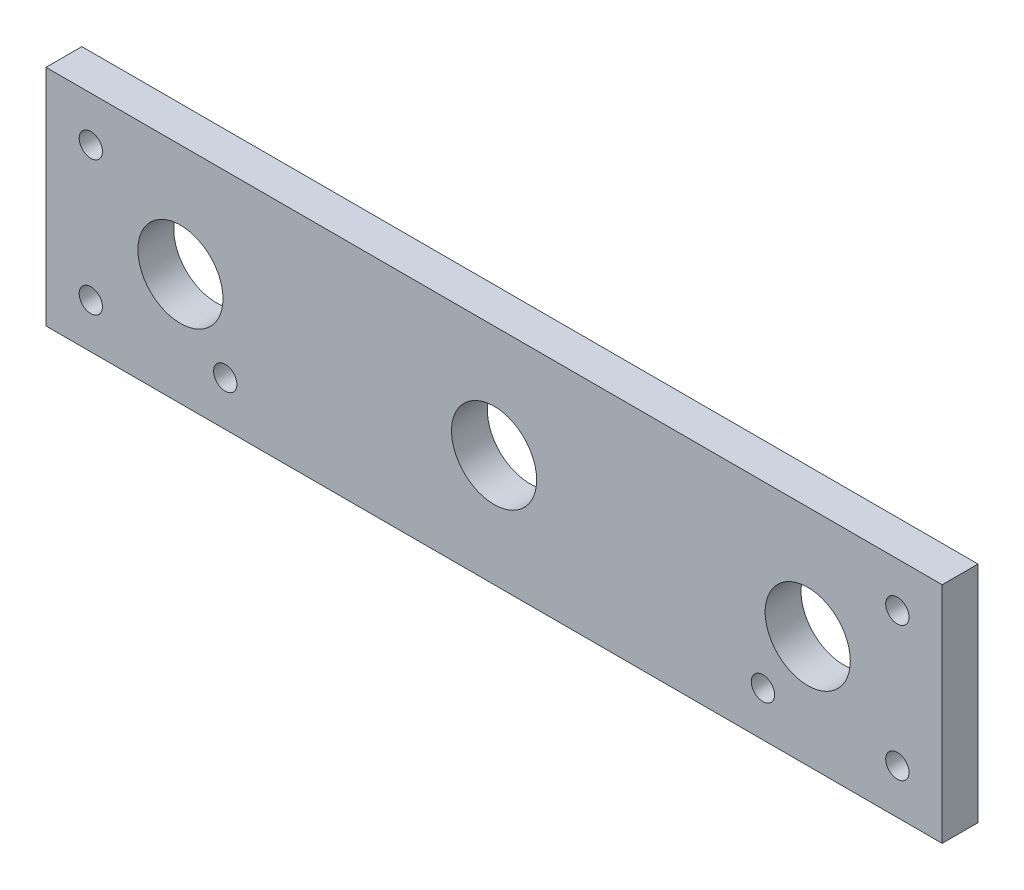
ISO-10303-21;
HEADER;
FILE_DESCRIPTION(('STEP AP214'),'2;1');
FILE_NAME('part.step','',(''),(''),'','','');
FILE_SCHEMA(('AUTOMOTIVE_DESIGN { 1 0 10303 214 1 1 1 1 }'));
ENDSEC;
DATA;
#1=APPLICATION_CONTEXT('core data for automotive mechanical design processes');
#2=APPLICATION_PROTOCOL_DEFINITION('international standard','automotive_design',2000,#1);
#3=PRODUCT_CONTEXT('',#1,'mechanical');
#4=PRODUCT('Part','Part','',(#3));
#5=PRODUCT_RELATED_PRODUCT_CATEGORY('part','',(#4));
#6=PRODUCT_DEFINITION_FORMATION('','',#4);
#7=PRODUCT_DEFINITION_CONTEXT('part definition',#1,'design');
#8=PRODUCT_DEFINITION('design','',#6,#7);
#9=PRODUCT_DEFINITION_SHAPE('','',#8);
#10=(LENGTH_UNIT() NAMED_UNIT(*) SI_UNIT(.MILLI.,.METRE.));
#11=(NAMED_UNIT(*) PLANE_ANGLE_UNIT() SI_UNIT($,.RADIAN.));
#12=(NAMED_UNIT(*) SI_UNIT($,.STERADIAN.) SOLID_ANGLE_UNIT());
#13=UNCERTAINTY_MEASURE_WITH_UNIT(LENGTH_MEASURE(1.E-05),#10,'distance_accuracy_value','');
#14=(GEOMETRIC_REPRESENTATION_CONTEXT(3) GLOBAL_UNCERTAINTY_ASSIGNED_CONTEXT((#13)) GLOBAL_UNIT_ASSIGNED_CONTEXT((#10,
#11,#12)) REPRESENTATION_CONTEXT('',''));
#15=CARTESIAN_POINT('',(0.,0.,0.));
#16=DIRECTION('',(0.,0.,1.));
#17=DIRECTION('',(1.,0.,0.));
#18=AXIS2_PLACEMENT_3D('',#15,#16,#17);
#19=CARTESIAN_POINT('',(0.,-1.68869309838472,8.));
#20=DIRECTION('',(0.,1.,0.));
#21=DIRECTION('',(0.,0.,1.));
#22=AXIS2_PLACEMENT_3D('',#19,#20,#21);
#23=PLANE('',#22);
#24=DIRECTION('',(1.,0.,0.));
#25=VECTOR('',#24,1.);
#26=CARTESIAN_POINT('',(0.,-1.68869309838472,0.));
#27=LINE('',#26,#25);
#28=CARTESIAN_POINT('',(-58.1497797356829,-1.68869309838472,0.));
#29=VERTEX_POINT('',#28);
#30=CARTESIAN_POINT('',(141.850220264317,-1.68869309838472,0.));
#31=VERTEX_POINT('',#30);
#32=EDGE_CURVE('E129',#29,#31,#27,.T.);
#33=ORIENTED_EDGE('',*,*,#32,.F.);
#34=DIRECTION('',(0.,0.,-1.));
#35=VECTOR('',#34,1.);
#36=CARTESIAN_POINT('',(-58.1497797356829,-1.68869309838472,8.));
#37=LINE('',#36,#35);
#38=CARTESIAN_POINT('',(-58.1497797356829,-1.68869309838472,8.));
#39=VERTEX_POINT('',#38);
#40=EDGE_CURVE('E11',#39,#29,#37,.T.);
#41=ORIENTED_EDGE('',*,*,#40,.F.);
#42=DIRECTION('',(1.,0.,0.));
#43=VECTOR('',#42,1.);
#44=CARTESIAN_POINT('',(0.,-1.68869309838472,8.));
#45=LINE('',#44,#43);
#46=CARTESIAN_POINT('',(141.850220264317,-1.68869309838472,8.));
#47=VERTEX_POINT('',#46);
#48=EDGE_CURVE('E100',#39,#47,#45,.T.);
#49=ORIENTED_EDGE('',*,*,#48,.T.);
#50=DIRECTION('',(0.,0.,-1.));
#51=VECTOR('',#50,1.);
#52=CARTESIAN_POINT('',(141.850220264317,-1.68869309838472,8.));
#53=LINE('',#52,#51);
#54=EDGE_CURVE('E60',#47,#31,#53,.T.);
#55=ORIENTED_EDGE('',*,*,#54,.T.);
#56=EDGE_LOOP('',(#33,#41,#49,#55));
#57=FACE_BOUND('',#56,.T.);
#58=ADVANCED_FACE('F41',(#57),#23,.T.);
#59=CARTESIAN_POINT('',(-58.1497797356829,0.,8.));
#60=DIRECTION('',(1.,0.,0.));
#61=DIRECTION('',(0.,1.,0.));
#62=AXIS2_PLACEMENT_3D('',#59,#60,#61);
#63=PLANE('',#62);
#64=DIRECTION('',(0.,-1.,0.));
#65=VECTOR('',#64,1.);
#66=CARTESIAN_POINT('',(-58.1497797356829,0.,0.));
#67=LINE('',#66,#65);
#68=CARTESIAN_POINT('',(-58.1497797356828,-51.6886930983847,0.));
#69=VERTEX_POINT('',#68);
#70=EDGE_CURVE('E106',#29,#69,#67,.T.);
#71=ORIENTED_EDGE('',*,*,#70,.T.);
#72=DIRECTION('',(0.,0.,-1.));
#73=VECTOR('',#72,1.);
#74=CARTESIAN_POINT('',(-58.1497797356828,-51.6886930983847,8.));
#75=LINE('',#74,#73);
#76=CARTESIAN_POINT('',(-58.1497797356828,-51.6886930983847,8.));
#77=VERTEX_POINT('',#76);
#78=EDGE_CURVE('E52',#77,#69,#75,.T.);
#79=ORIENTED_EDGE('',*,*,#78,.F.);
#80=DIRECTION('',(0.,-1.,0.));
#81=VECTOR('',#80,1.);
#82=CARTESIAN_POINT('',(-58.1497797356829,0.,8.));
#83=LINE('',#82,#81);
#84=EDGE_CURVE('E95',#39,#77,#83,.T.);
#85=ORIENTED_EDGE('',*,*,#84,.F.);
#86=ORIENTED_EDGE('',*,*,#40,.T.);
#87=EDGE_LOOP('',(#71,#79,#85,#86));
#88=FACE_BOUND('',#87,.T.);
#89=ADVANCED_FACE('F104',(#88),#63,.F.);
#90=CARTESIAN_POINT('',(0.,-51.6886930983847,8.));
#91=DIRECTION('',(0.,1.,0.));
#92=DIRECTION('',(0.,0.,1.));
#93=AXIS2_PLACEMENT_3D('',#90,#91,#92);
#94=PLANE('',#93);
#95=DIRECTION('',(1.,0.,0.));
#96=VECTOR('',#95,1.);
#97=CARTESIAN_POINT('',(0.,-51.6886930983847,0.));
#98=LINE('',#97,#96);
#99=CARTESIAN_POINT('',(141.850220264317,-51.6886930983847,0.));
#100=VERTEX_POINT('',#99);
#101=EDGE_CURVE('E124',#69,#100,#98,.T.);
#102=ORIENTED_EDGE('',*,*,#101,.T.);
#103=DIRECTION('',(0.,0.,-1.));
#104=VECTOR('',#103,1.);
#105=CARTESIAN_POINT('',(141.850220264317,-51.6886930983847,8.));
#106=LINE('',#105,#104);
#107=CARTESIAN_POINT('',(141.850220264317,-51.6886930983847,8.));
#108=VERTEX_POINT('',#107);
#109=EDGE_CURVE('E74',#108,#100,#106,.T.);
#110=ORIENTED_EDGE('',*,*,#109,.F.);
#111=DIRECTION('',(1.,0.,0.));
#112=VECTOR('',#111,1.);
#113=CARTESIAN_POINT('',(0.,-51.6886930983847,8.));
#114=LINE('',#113,#112);
#115=EDGE_CURVE('E86',#77,#108,#114,.T.);
#116=ORIENTED_EDGE('',*,*,#115,.F.);
#117=ORIENTED_EDGE('',*,*,#78,.T.);
#118=EDGE_LOOP('',(#102,#110,#116,#117));
#119=FACE_BOUND('',#118,.T.);
#120=ADVANCED_FACE('F88',(#119),#94,.F.);
#121=CARTESIAN_POINT('',(141.850220264317,0.,8.));
#122=DIRECTION('',(1.,0.,0.));
#123=DIRECTION('',(0.,0.,-1.));
#124=AXIS2_PLACEMENT_3D('',#121,#122,#123);
#125=PLANE('',#124);
#126=DIRECTION('',(0.,-1.,0.));
#127=VECTOR('',#126,1.);
#128=CARTESIAN_POINT('',(141.850220264317,0.,0.));
#129=LINE('',#128,#127);
#130=EDGE_CURVE('E120',#31,#100,#129,.T.);
#131=ORIENTED_EDGE('',*,*,#130,.F.);
#132=ORIENTED_EDGE('',*,*,#54,.F.);
#133=DIRECTION('',(0.,-1.,0.));
#134=VECTOR('',#133,1.);
#135=CARTESIAN_POINT('',(141.850220264317,0.,8.));
#136=LINE('',#135,#134);
#137=EDGE_CURVE('E94',#47,#108,#136,.T.);
#138=ORIENTED_EDGE('',*,*,#137,.T.);
#139=ORIENTED_EDGE('',*,*,#109,.T.);
#140=EDGE_LOOP('',(#131,#132,#138,#139));
#141=FACE_BOUND('',#140,.T.);
#142=ADVANCED_FACE('F224',(#141),#125,.T.);
#143=CARTESIAN_POINT('',(111.850220264317,-26.6886930983847,8.));
#144=DIRECTION('',(0.,0.,-1.));
#145=DIRECTION('',(-1.,0.,0.));
#146=AXIS2_PLACEMENT_3D('',#143,#144,#145);
#147=CYLINDRICAL_SURFACE('',#146,9.49999999999999);
#148=CARTESIAN_POINT('',(111.850220264317,-26.6886930983847,8.));
#149=DIRECTION('',(0.,0.,1.));
#150=DIRECTION('',(1.,0.,0.));
#151=AXIS2_PLACEMENT_3D('',#148,#149,#150);
#152=CIRCLE('',#151,9.49999999999999);
#153=CARTESIAN_POINT('',(121.350220264317,-26.6886930983847,8.));
#154=VERTEX_POINT('',#153);
#155=EDGE_CURVE('E119',#154,#154,#152,.T.);
#156=ORIENTED_EDGE('',*,*,#155,.T.);
#157=EDGE_LOOP('',(#156));
#158=FACE_BOUND('',#157,.T.);
#159=CARTESIAN_POINT('',(111.850220264317,-26.6886930983847,0.));
#160=DIRECTION('',(0.,0.,1.));
#161=DIRECTION('',(1.,0.,0.));
#162=AXIS2_PLACEMENT_3D('',#159,#160,#161);
#163=CIRCLE('',#162,9.49999999999999);
#164=CARTESIAN_POINT('',(121.350220264317,-26.6886930983847,0.));
#165=VERTEX_POINT('',#164);
#166=EDGE_CURVE('E132',#165,#165,#163,.T.);
#167=ORIENTED_EDGE('',*,*,#166,.F.);
#168=EDGE_LOOP('',(#167));
#169=FACE_BOUND('',#168,.T.);
#170=ADVANCED_FACE('F43',(#158,#169),#147,.F.);
#171=CARTESIAN_POINT('',(-28.1497797356829,-26.6886930983847,8.));
#172=DIRECTION('',(0.,0.,-1.));
#173=DIRECTION('',(-1.,0.,0.));
#174=AXIS2_PLACEMENT_3D('',#171,#172,#173);
#175=CYLINDRICAL_SURFACE('',#174,9.5);
#176=CARTESIAN_POINT('',(-28.1497797356829,-26.6886930983847,8.));
#177=DIRECTION('',(0.,0.,1.));
#178=DIRECTION('',(1.,0.,0.));
#179=AXIS2_PLACEMENT_3D('',#176,#177,#178);
#180=CIRCLE('',#179,9.5);
#181=CARTESIAN_POINT('',(-18.6497797356829,-26.6886930983847,8.));
#182=VERTEX_POINT('',#181);
#183=EDGE_CURVE('E114',#182,#182,#180,.T.);
#184=ORIENTED_EDGE('',*,*,#183,.T.);
#185=EDGE_LOOP('',(#184));
#186=FACE_BOUND('',#185,.T.);
#187=CARTESIAN_POINT('',(-28.1497797356829,-26.6886930983847,0.));
#188=DIRECTION('',(0.,0.,1.));
#189=DIRECTION('',(1.,0.,0.));
#190=AXIS2_PLACEMENT_3D('',#187,#188,#189);
#191=CIRCLE('',#190,9.5);
#192=CARTESIAN_POINT('',(-18.6497797356829,-26.6886930983847,0.));
#193=VERTEX_POINT('',#192);
#194=EDGE_CURVE('E115',#193,#193,#191,.T.);
#195=ORIENTED_EDGE('',*,*,#194,.F.);
#196=EDGE_LOOP('',(#195));
#197=FACE_BOUND('',#196,.T.);
#198=ADVANCED_FACE('F227',(#186,#197),#175,.F.);
#199=CARTESIAN_POINT('',(0.,0.,8.));
#200=DIRECTION('',(0.,0.,1.));
#201=DIRECTION('',(1.,0.,0.));
#202=AXIS2_PLACEMENT_3D('',#199,#200,#201);
#203=PLANE('',#202);
#204=CARTESIAN_POINT('',(41.8502202643172,-26.6886930983847,8.));
#205=DIRECTION('',(0.,0.,1.));
#206=DIRECTION('',(1.,0.,0.));
#207=AXIS2_PLACEMENT_3D('',#204,#205,#206);
#208=CIRCLE('',#207,9.5);
#209=CARTESIAN_POINT('',(51.3502202643172,-26.6886930983847,8.));
#210=VERTEX_POINT('',#209);
#211=EDGE_CURVE('E194',#210,#210,#208,.T.);
#212=ORIENTED_EDGE('',*,*,#211,.F.);
#213=EDGE_LOOP('',(#212));
#214=FACE_BOUND('',#213,.T.);
#215=CARTESIAN_POINT('',(-18.1497797356829,-41.6886930983847,8.));
#216=DIRECTION('',(0.,0.,1.));
#217=DIRECTION('',(1.,0.,0.));
#218=AXIS2_PLACEMENT_3D('',#215,#216,#217);
#219=CIRCLE('',#218,2.59999999999999);
#220=CARTESIAN_POINT('',(-15.5497797356829,-41.6886930983847,8.));
#221=VERTEX_POINT('',#220);
#222=EDGE_CURVE('E190',#221,#221,#219,.T.);
#223=ORIENTED_EDGE('',*,*,#222,.F.);
#224=EDGE_LOOP('',(#223));
#225=FACE_BOUND('',#224,.T.);
#226=CARTESIAN_POINT('',(101.850220264317,-41.6886930983847,8.));
#227=DIRECTION('',(0.,0.,1.));
#228=DIRECTION('',(1.,0.,0.));
#229=AXIS2_PLACEMENT_3D('',#226,#227,#228);
#230=CIRCLE('',#229,2.59999999999999);
#231=CARTESIAN_POINT('',(104.450220264317,-41.6886930983847,8.));
#232=VERTEX_POINT('',#231);
#233=EDGE_CURVE('E182',#232,#232,#230,.T.);
#234=ORIENTED_EDGE('',*,*,#233,.F.);
#235=EDGE_LOOP('',(#234));
#236=FACE_BOUND('',#235,.T.);
#237=CARTESIAN_POINT('',(-48.1497797356828,-11.6886930983847,8.));
#238=DIRECTION('',(0.,0.,1.));
#239=DIRECTION('',(1.,0.,0.));
#240=AXIS2_PLACEMENT_3D('',#237,#238,#239);
#241=CIRCLE('',#240,2.59999999999999);
#242=CARTESIAN_POINT('',(-45.5497797356829,-11.6886930983847,8.));
#243=VERTEX_POINT('',#242);
#244=EDGE_CURVE('E174',#243,#243,#241,.T.);
#245=ORIENTED_EDGE('',*,*,#244,.F.);
#246=EDGE_LOOP('',(#245));
#247=FACE_BOUND('',#246,.T.);
#248=CARTESIAN_POINT('',(-48.1497797356828,-41.6886930983847,8.));
#249=DIRECTION('',(0.,0.,1.));
#250=DIRECTION('',(1.,0.,0.));
#251=AXIS2_PLACEMENT_3D('',#248,#249,#250);
#252=CIRCLE('',#251,2.59999999999998);
#253=CARTESIAN_POINT('',(-45.5497797356829,-41.6886930983847,8.));
#254=VERTEX_POINT('',#253);
#255=EDGE_CURVE('E166',#254,#254,#252,.T.);
#256=ORIENTED_EDGE('',*,*,#255,.F.);
#257=EDGE_LOOP('',(#256));
#258=FACE_BOUND('',#257,.T.);
#259=CARTESIAN_POINT('',(131.850220264317,-41.6886930983847,8.));
#260=DIRECTION('',(0.,0.,1.));
#261=DIRECTION('',(1.,0.,0.));
#262=AXIS2_PLACEMENT_3D('',#259,#260,#261);
#263=CIRCLE('',#262,2.59999999999999);
#264=CARTESIAN_POINT('',(134.450220264317,-41.6886930983847,8.));
#265=VERTEX_POINT('',#264);
#266=EDGE_CURVE('E158',#265,#265,#263,.T.);
#267=ORIENTED_EDGE('',*,*,#266,.F.);
#268=EDGE_LOOP('',(#267));
#269=FACE_BOUND('',#268,.T.);
#270=CARTESIAN_POINT('',(131.850220264317,-11.6886930983847,8.));
#271=DIRECTION('',(0.,0.,1.));
#272=DIRECTION('',(1.,0.,0.));
#273=AXIS2_PLACEMENT_3D('',#270,#271,#272);
#274=CIRCLE('',#273,2.59999999999999);
#275=CARTESIAN_POINT('',(134.450220264317,-11.6886930983847,8.));
#276=VERTEX_POINT('',#275);
#277=EDGE_CURVE('E150',#276,#276,#274,.T.);
#278=ORIENTED_EDGE('',*,*,#277,.F.);
#279=EDGE_LOOP('',(#278));
#280=FACE_BOUND('',#279,.T.);
#281=ORIENTED_EDGE('',*,*,#155,.F.);
#282=EDGE_LOOP('',(#281));
#283=FACE_BOUND('',#282,.T.);
#284=ORIENTED_EDGE('',*,*,#48,.F.);
#285=ORIENTED_EDGE('',*,*,#84,.T.);
#286=ORIENTED_EDGE('',*,*,#115,.T.);
#287=ORIENTED_EDGE('',*,*,#137,.F.);
#288=EDGE_LOOP('',(#284,#285,#286,#287));
#289=FACE_BOUND('',#288,.T.);
#290=ORIENTED_EDGE('',*,*,#183,.F.);
#291=EDGE_LOOP('',(#290));
#292=FACE_BOUND('',#291,.T.);
#293=ADVANCED_FACE('F98',(#214,#225,#236,#247,#258,#269,#280,#283,#289,#292),#203,.T.);
#294=CARTESIAN_POINT('',(0.,0.,0.));
#295=DIRECTION('',(0.,0.,1.));
#296=DIRECTION('',(1.,0.,0.));
#297=AXIS2_PLACEMENT_3D('',#294,#295,#296);
#298=PLANE('',#297);
#299=CARTESIAN_POINT('',(41.8502202643172,-26.6886930983847,0.));
#300=DIRECTION('',(0.,0.,1.));
#301=DIRECTION('',(1.,0.,0.));
#302=AXIS2_PLACEMENT_3D('',#299,#300,#301);
#303=CIRCLE('',#302,9.5);
#304=CARTESIAN_POINT('',(51.3502202643172,-26.6886930983847,0.));
#305=VERTEX_POINT('',#304);
#306=EDGE_CURVE('E45',#305,#305,#303,.T.);
#307=ORIENTED_EDGE('',*,*,#306,.T.);
#308=EDGE_LOOP('',(#307));
#309=FACE_BOUND('',#308,.T.);
#310=CARTESIAN_POINT('',(-18.1497797356829,-41.6886930983847,0.));
#311=DIRECTION('',(0.,0.,1.));
#312=DIRECTION('',(1.,0.,0.));
#313=AXIS2_PLACEMENT_3D('',#310,#311,#312);
#314=CIRCLE('',#313,2.59999999999999);
#315=CARTESIAN_POINT('',(-15.5497797356829,-41.6886930983847,0.));
#316=VERTEX_POINT('',#315);
#317=EDGE_CURVE('E186',#316,#316,#314,.T.);
#318=ORIENTED_EDGE('',*,*,#317,.T.);
#319=EDGE_LOOP('',(#318));
#320=FACE_BOUND('',#319,.T.);
#321=CARTESIAN_POINT('',(101.850220264317,-41.6886930983847,0.));
#322=DIRECTION('',(0.,0.,1.));
#323=DIRECTION('',(1.,0.,0.));
#324=AXIS2_PLACEMENT_3D('',#321,#322,#323);
#325=CIRCLE('',#324,2.6);
#326=CARTESIAN_POINT('',(104.450220264317,-41.6886930983847,0.));
#327=VERTEX_POINT('',#326);
#328=EDGE_CURVE('E178',#327,#327,#325,.T.);
#329=ORIENTED_EDGE('',*,*,#328,.T.);
#330=EDGE_LOOP('',(#329));
#331=FACE_BOUND('',#330,.T.);
#332=CARTESIAN_POINT('',(-48.1497797356828,-11.6886930983847,0.));
#333=DIRECTION('',(0.,0.,1.));
#334=DIRECTION('',(1.,0.,0.));
#335=AXIS2_PLACEMENT_3D('',#332,#333,#334);
#336=CIRCLE('',#335,2.59999999999999);
#337=CARTESIAN_POINT('',(-45.5497797356829,-11.6886930983847,0.));
#338=VERTEX_POINT('',#337);
#339=EDGE_CURVE('E170',#338,#338,#336,.T.);
#340=ORIENTED_EDGE('',*,*,#339,.T.);
#341=EDGE_LOOP('',(#340));
#342=FACE_BOUND('',#341,.T.);
#343=CARTESIAN_POINT('',(-48.1497797356828,-41.6886930983847,0.));
#344=DIRECTION('',(0.,0.,1.));
#345=DIRECTION('',(1.,0.,0.));
#346=AXIS2_PLACEMENT_3D('',#343,#344,#345);
#347=CIRCLE('',#346,2.59999999999999);
#348=CARTESIAN_POINT('',(-45.5497797356829,-41.6886930983847,0.));
#349=VERTEX_POINT('',#348);
#350=EDGE_CURVE('E162',#349,#349,#347,.T.);
#351=ORIENTED_EDGE('',*,*,#350,.T.);
#352=EDGE_LOOP('',(#351));
#353=FACE_BOUND('',#352,.T.);
#354=CARTESIAN_POINT('',(131.850220264317,-41.6886930983847,0.));
#355=DIRECTION('',(0.,0.,1.));
#356=DIRECTION('',(1.,0.,0.));
#357=AXIS2_PLACEMENT_3D('',#354,#355,#356);
#358=CIRCLE('',#357,2.59999999999999);
#359=CARTESIAN_POINT('',(134.450220264317,-41.6886930983847,0.));
#360=VERTEX_POINT('',#359);
#361=EDGE_CURVE('E154',#360,#360,#358,.T.);
#362=ORIENTED_EDGE('',*,*,#361,.T.);
#363=EDGE_LOOP('',(#362));
#364=FACE_BOUND('',#363,.T.);
#365=CARTESIAN_POINT('',(131.850220264317,-11.6886930983847,0.));
#366=DIRECTION('',(0.,0.,1.));
#367=DIRECTION('',(1.,0.,0.));
#368=AXIS2_PLACEMENT_3D('',#365,#366,#367);
#369=CIRCLE('',#368,2.59999999999999);
#370=CARTESIAN_POINT('',(134.450220264317,-11.6886930983847,0.));
#371=VERTEX_POINT('',#370);
#372=EDGE_CURVE('E136',#371,#371,#369,.T.);
#373=ORIENTED_EDGE('',*,*,#372,.T.);
#374=EDGE_LOOP('',(#373));
#375=FACE_BOUND('',#374,.T.);
#376=ORIENTED_EDGE('',*,*,#166,.T.);
#377=EDGE_LOOP('',(#376));
#378=FACE_BOUND('',#377,.T.);
#379=ORIENTED_EDGE('',*,*,#32,.T.);
#380=ORIENTED_EDGE('',*,*,#130,.T.);
#381=ORIENTED_EDGE('',*,*,#101,.F.);
#382=ORIENTED_EDGE('',*,*,#70,.F.);
#383=EDGE_LOOP('',(#379,#380,#381,#382));
#384=FACE_BOUND('',#383,.T.);
#385=ORIENTED_EDGE('',*,*,#194,.T.);
#386=EDGE_LOOP('',(#385));
#387=FACE_BOUND('',#386,.T.);
#388=ADVANCED_FACE('F203',(#309,#320,#331,#342,#353,#364,#375,#378,#384,#387),#298,.F.);
#389=CARTESIAN_POINT('',(131.850220264317,-11.6886930983847,8.));
#390=DIRECTION('',(0.,0.,1.));
#391=DIRECTION('',(1.,0.,0.));
#392=AXIS2_PLACEMENT_3D('',#389,#390,#391);
#393=CYLINDRICAL_SURFACE('',#392,2.59999999999999);
#394=ORIENTED_EDGE('',*,*,#372,.F.);
#395=EDGE_LOOP('',(#394));
#396=FACE_BOUND('',#395,.T.);
#397=ORIENTED_EDGE('',*,*,#277,.T.);
#398=EDGE_LOOP('',(#397));
#399=FACE_BOUND('',#398,.T.);
#400=ADVANCED_FACE('F233',(#396,#399),#393,.F.);
#401=CARTESIAN_POINT('',(131.850220264317,-41.6886930983847,8.));
#402=DIRECTION('',(0.,0.,1.));
#403=DIRECTION('',(1.,0.,0.));
#404=AXIS2_PLACEMENT_3D('',#401,#402,#403);
#405=CYLINDRICAL_SURFACE('',#404,2.59999999999999);
#406=ORIENTED_EDGE('',*,*,#361,.F.);
#407=EDGE_LOOP('',(#406));
#408=FACE_BOUND('',#407,.T.);
#409=ORIENTED_EDGE('',*,*,#266,.T.);
#410=EDGE_LOOP('',(#409));
#411=FACE_BOUND('',#410,.T.);
#412=ADVANCED_FACE('F239',(#408,#411),#405,.F.);
#413=CARTESIAN_POINT('',(-48.1497797356828,-41.6886930983847,8.));
#414=DIRECTION('',(0.,0.,1.));
#415=DIRECTION('',(1.,0.,0.));
#416=AXIS2_PLACEMENT_3D('',#413,#414,#415);
#417=CYLINDRICAL_SURFACE('',#416,2.59999999999999);
#418=ORIENTED_EDGE('',*,*,#350,.F.);
#419=EDGE_LOOP('',(#418));
#420=FACE_BOUND('',#419,.T.);
#421=ORIENTED_EDGE('',*,*,#255,.T.);
#422=EDGE_LOOP('',(#421));
#423=FACE_BOUND('',#422,.T.);
#424=ADVANCED_FACE('F243',(#420,#423),#417,.F.);
#425=CARTESIAN_POINT('',(-48.1497797356828,-11.6886930983847,8.));
#426=DIRECTION('',(0.,0.,1.));
#427=DIRECTION('',(1.,0.,0.));
#428=AXIS2_PLACEMENT_3D('',#425,#426,#427);
#429=CYLINDRICAL_SURFACE('',#428,2.59999999999999);
#430=ORIENTED_EDGE('',*,*,#339,.F.);
#431=EDGE_LOOP('',(#430));
#432=FACE_BOUND('',#431,.T.);
#433=ORIENTED_EDGE('',*,*,#244,.T.);
#434=EDGE_LOOP('',(#433));
#435=FACE_BOUND('',#434,.T.);
#436=ADVANCED_FACE('F247',(#432,#435),#429,.F.);
#437=CARTESIAN_POINT('',(101.850220264317,-41.6886930983847,8.));
#438=DIRECTION('',(0.,0.,1.));
#439=DIRECTION('',(1.,0.,0.));
#440=AXIS2_PLACEMENT_3D('',#437,#438,#439);
#441=CYLINDRICAL_SURFACE('',#440,2.6);
#442=ORIENTED_EDGE('',*,*,#328,.F.);
#443=EDGE_LOOP('',(#442));
#444=FACE_BOUND('',#443,.T.);
#445=ORIENTED_EDGE('',*,*,#233,.T.);
#446=EDGE_LOOP('',(#445));
#447=FACE_BOUND('',#446,.T.);
#448=ADVANCED_FACE('F213',(#444,#447),#441,.F.);
#449=CARTESIAN_POINT('',(-18.1497797356829,-41.6886930983847,8.));
#450=DIRECTION('',(0.,0.,1.));
#451=DIRECTION('',(1.,0.,0.));
#452=AXIS2_PLACEMENT_3D('',#449,#450,#451);
#453=CYLINDRICAL_SURFACE('',#452,2.59999999999999);
#454=ORIENTED_EDGE('',*,*,#317,.F.);
#455=EDGE_LOOP('',(#454));
#456=FACE_BOUND('',#455,.T.);
#457=ORIENTED_EDGE('',*,*,#222,.T.);
#458=EDGE_LOOP('',(#457));
#459=FACE_BOUND('',#458,.T.);
#460=ADVANCED_FACE('F208',(#456,#459),#453,.F.);
#461=CARTESIAN_POINT('',(41.8502202643172,-26.6886930983847,-2.));
#462=DIRECTION('',(0.,0.,1.));
#463=DIRECTION('',(1.,0.,0.));
#464=AXIS2_PLACEMENT_3D('',#461,#462,#463);
#465=CYLINDRICAL_SURFACE('',#464,9.5);
#466=ORIENTED_EDGE('',*,*,#211,.T.);
#467=EDGE_LOOP('',(#466));
#468=FACE_BOUND('',#467,.T.);
#469=ORIENTED_EDGE('',*,*,#306,.F.);
#470=EDGE_LOOP('',(#469));
#471=FACE_BOUND('',#470,.T.);
#472=ADVANCED_FACE('F206',(#468,#471),#465,.F.);
#473=CLOSED_SHELL('',(#58,#89,#120,#142,#170,#198,#293,#388,#400,#412,#424,#436,#448,#460,#472));
#474=MANIFOLD_SOLID_BREP('B2',#473);
#475=ADVANCED_BREP_SHAPE_REPRESENTATION('',(#18,#474),#14);
#476=SHAPE_DEFINITION_REPRESENTATION(#9,#475);
ENDSEC;
END-ISO-10303-21;
